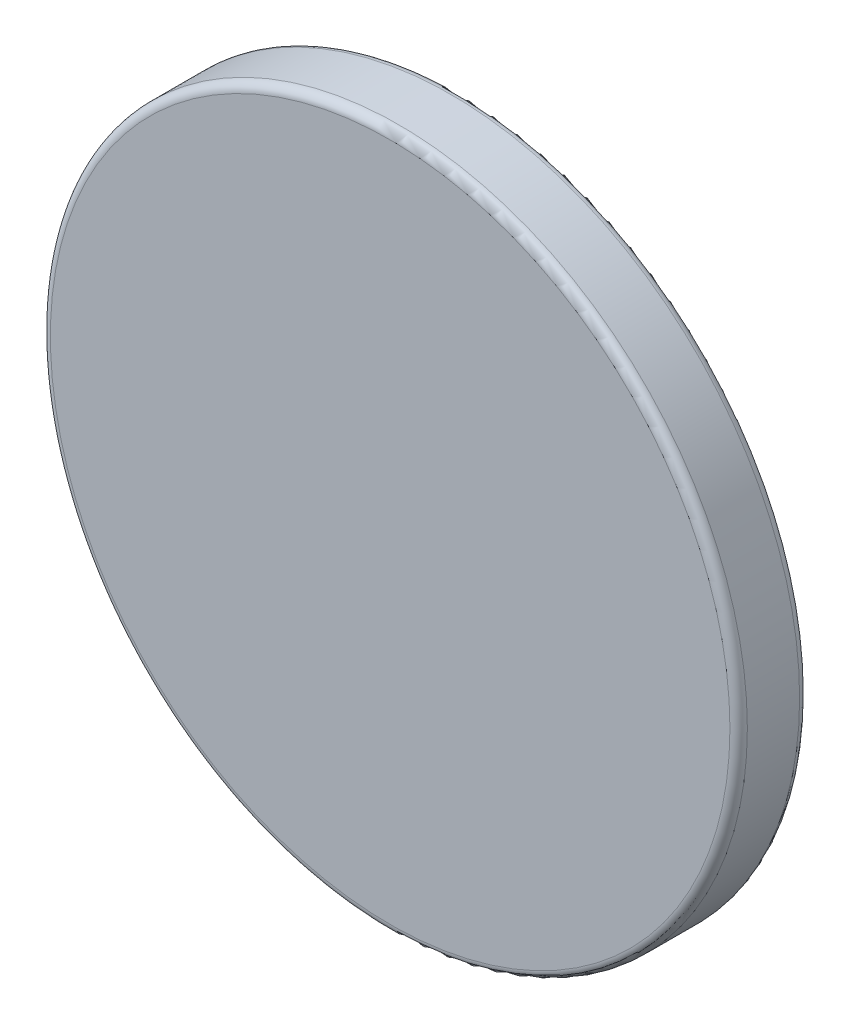
ISO-10303-21;
HEADER;
FILE_DESCRIPTION(('STEP AP214'),'2;1');
FILE_NAME('part.step','',(''),(''),'','','');
FILE_SCHEMA(('AUTOMOTIVE_DESIGN { 1 0 10303 214 1 1 1 1 }'));
ENDSEC;
DATA;
#1=APPLICATION_CONTEXT('core data for automotive mechanical design processes');
#2=APPLICATION_PROTOCOL_DEFINITION('international standard','automotive_design',2000,#1);
#3=PRODUCT_CONTEXT('',#1,'mechanical');
#4=PRODUCT('Part','Part','',(#3));
#5=PRODUCT_RELATED_PRODUCT_CATEGORY('part','',(#4));
#6=PRODUCT_DEFINITION_FORMATION('','',#4);
#7=PRODUCT_DEFINITION_CONTEXT('part definition',#1,'design');
#8=PRODUCT_DEFINITION('design','',#6,#7);
#9=PRODUCT_DEFINITION_SHAPE('','',#8);
#10=(LENGTH_UNIT() NAMED_UNIT(*) SI_UNIT(.MILLI.,.METRE.));
#11=(NAMED_UNIT(*) PLANE_ANGLE_UNIT() SI_UNIT($,.RADIAN.));
#12=(NAMED_UNIT(*) SI_UNIT($,.STERADIAN.) SOLID_ANGLE_UNIT());
#13=UNCERTAINTY_MEASURE_WITH_UNIT(LENGTH_MEASURE(1.E-05),#10,'distance_accuracy_value','');
#14=(GEOMETRIC_REPRESENTATION_CONTEXT(3) GLOBAL_UNCERTAINTY_ASSIGNED_CONTEXT((#13)) GLOBAL_UNIT_ASSIGNED_CONTEXT((#10,
#11,#12)) REPRESENTATION_CONTEXT('',''));
#15=CARTESIAN_POINT('',(0.,0.,0.));
#16=DIRECTION('',(0.,0.,1.));
#17=DIRECTION('',(1.,0.,0.));
#18=AXIS2_PLACEMENT_3D('',#15,#16,#17);
#19=CARTESIAN_POINT('',(0.,0.,2.));
#20=DIRECTION('',(0.,0.,-1.));
#21=DIRECTION('',(-1.,0.,0.));
#22=AXIS2_PLACEMENT_3D('',#19,#20,#21);
#23=CYLINDRICAL_SURFACE('',#22,10.);
#24=CARTESIAN_POINT('',(0.,0.,0.25));
#25=DIRECTION('',(0.,0.,1.));
#26=DIRECTION('',(1.,0.,0.));
#27=AXIS2_PLACEMENT_3D('',#24,#25,#26);
#28=CIRCLE('',#27,10.);
#29=CARTESIAN_POINT('',(10.,0.,0.25));
#30=VERTEX_POINT('',#29);
#31=EDGE_CURVE('E50',#30,#30,#28,.T.);
#32=ORIENTED_EDGE('',*,*,#31,.T.);
#33=EDGE_LOOP('',(#32));
#34=FACE_BOUND('',#33,.T.);
#35=CARTESIAN_POINT('',(0.,0.,1.75));
#36=DIRECTION('',(0.,0.,1.));
#37=DIRECTION('',(1.,0.,0.));
#38=AXIS2_PLACEMENT_3D('',#35,#36,#37);
#39=CIRCLE('',#38,10.);
#40=CARTESIAN_POINT('',(10.,0.,1.75));
#41=VERTEX_POINT('',#40);
#42=EDGE_CURVE('E55',#41,#41,#39,.F.);
#43=ORIENTED_EDGE('',*,*,#42,.T.);
#44=EDGE_LOOP('',(#43));
#45=FACE_BOUND('',#44,.T.);
#46=ADVANCED_FACE('F37',(#34,#45),#23,.T.);
#47=CARTESIAN_POINT('',(0.,0.,2.));
#48=DIRECTION('',(0.,0.,1.));
#49=DIRECTION('',(1.,0.,0.));
#50=AXIS2_PLACEMENT_3D('',#47,#48,#49);
#51=PLANE('',#50);
#52=CARTESIAN_POINT('',(0.,0.,2.));
#53=DIRECTION('',(0.,0.,1.));
#54=DIRECTION('',(1.,0.,0.));
#55=AXIS2_PLACEMENT_3D('',#52,#53,#54);
#56=CIRCLE('',#55,9.75);
#57=CARTESIAN_POINT('',(9.75,0.,2.));
#58=VERTEX_POINT('',#57);
#59=EDGE_CURVE('E10',#58,#58,#56,.T.);
#60=ORIENTED_EDGE('',*,*,#59,.T.);
#61=EDGE_LOOP('',(#60));
#62=FACE_BOUND('',#61,.T.);
#63=ADVANCED_FACE('F72',(#62),#51,.T.);
#64=CARTESIAN_POINT('',(0.,0.,0.));
#65=DIRECTION('',(0.,0.,1.));
#66=DIRECTION('',(1.,0.,0.));
#67=AXIS2_PLACEMENT_3D('',#64,#65,#66);
#68=PLANE('',#67);
#69=CARTESIAN_POINT('',(0.,0.,0.));
#70=DIRECTION('',(0.,0.,1.));
#71=DIRECTION('',(1.,0.,0.));
#72=AXIS2_PLACEMENT_3D('',#69,#70,#71);
#73=CIRCLE('',#72,9.75);
#74=CARTESIAN_POINT('',(9.75,0.,0.));
#75=VERTEX_POINT('',#74);
#76=EDGE_CURVE('E45',#75,#75,#73,.F.);
#77=ORIENTED_EDGE('',*,*,#76,.T.);
#78=EDGE_LOOP('',(#77));
#79=FACE_BOUND('',#78,.T.);
#80=ADVANCED_FACE('F69',(#79),#68,.F.);
#81=CARTESIAN_POINT('',(0.,0.,0.25));
#82=DIRECTION('',(0.,0.,1.));
#83=DIRECTION('',(1.,0.,0.));
#84=AXIS2_PLACEMENT_3D('',#81,#82,#83);
#85=TOROIDAL_SURFACE('',#84,9.75,0.25);
#86=ORIENTED_EDGE('',*,*,#76,.F.);
#87=EDGE_LOOP('',(#86));
#88=FACE_BOUND('',#87,.T.);
#89=ORIENTED_EDGE('',*,*,#31,.F.);
#90=EDGE_LOOP('',(#89));
#91=FACE_BOUND('',#90,.T.);
#92=ADVANCED_FACE('F65',(#88,#91),#85,.T.);
#93=CARTESIAN_POINT('',(0.,0.,1.75));
#94=DIRECTION('',(0.,0.,1.));
#95=DIRECTION('',(1.,0.,0.));
#96=AXIS2_PLACEMENT_3D('',#93,#94,#95);
#97=TOROIDAL_SURFACE('',#96,9.75,0.25);
#98=ORIENTED_EDGE('',*,*,#42,.F.);
#99=EDGE_LOOP('',(#98));
#100=FACE_BOUND('',#99,.T.);
#101=ORIENTED_EDGE('',*,*,#59,.F.);
#102=EDGE_LOOP('',(#101));
#103=FACE_BOUND('',#102,.T.);
#104=ADVANCED_FACE('F39',(#100,#103),#97,.T.);
#105=CLOSED_SHELL('',(#46,#63,#80,#92,#104));
#106=MANIFOLD_SOLID_BREP('B2',#105);
#107=ADVANCED_BREP_SHAPE_REPRESENTATION('',(#18,#106),#14);
#108=SHAPE_DEFINITION_REPRESENTATION(#9,#107);
ENDSEC;
END-ISO-10303-21;
